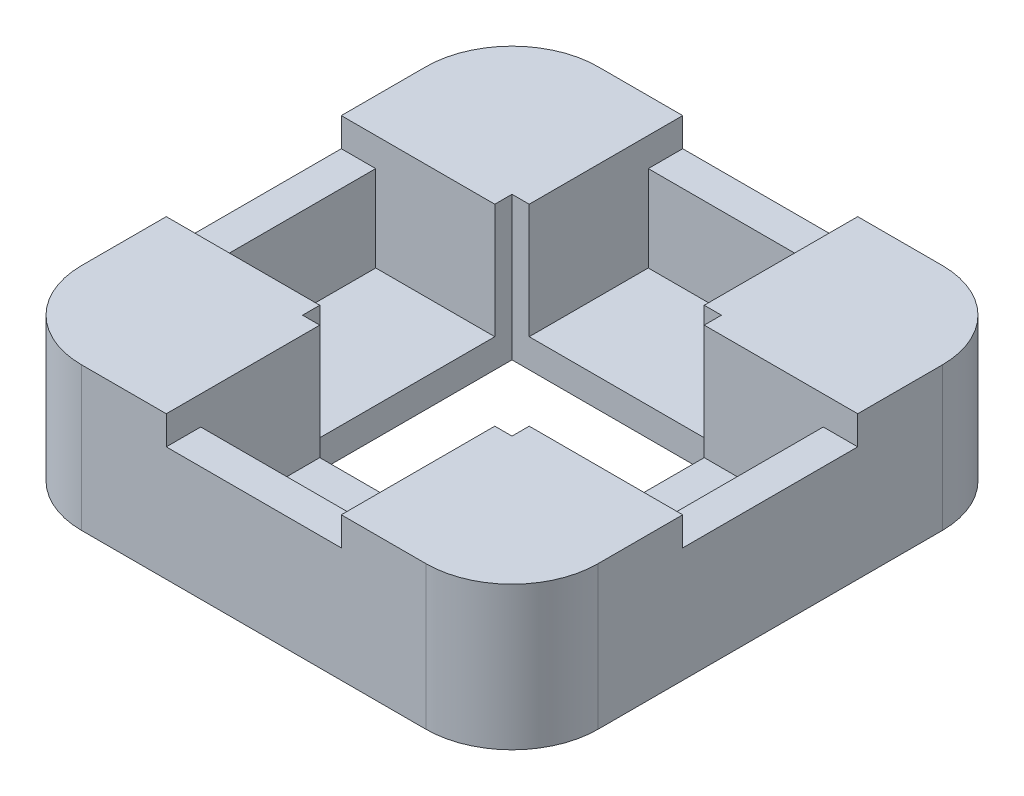
ISO-10303-21;
HEADER;
FILE_DESCRIPTION(('STEP AP214'),'2;1');
FILE_NAME('part.step','',(''),(''),'','','');
FILE_SCHEMA(('AUTOMOTIVE_DESIGN { 1 0 10303 214 1 1 1 1 }'));
ENDSEC;
DATA;
#1=APPLICATION_CONTEXT('core data for automotive mechanical design processes');
#2=APPLICATION_PROTOCOL_DEFINITION('international standard','automotive_design',2000,#1);
#3=PRODUCT_CONTEXT('',#1,'mechanical');
#4=PRODUCT('Part','Part','',(#3));
#5=PRODUCT_RELATED_PRODUCT_CATEGORY('part','',(#4));
#6=PRODUCT_DEFINITION_FORMATION('','',#4);
#7=PRODUCT_DEFINITION_CONTEXT('part definition',#1,'design');
#8=PRODUCT_DEFINITION('design','',#6,#7);
#9=PRODUCT_DEFINITION_SHAPE('','',#8);
#10=(LENGTH_UNIT() NAMED_UNIT(*) SI_UNIT(.MILLI.,.METRE.));
#11=(NAMED_UNIT(*) PLANE_ANGLE_UNIT() SI_UNIT($,.RADIAN.));
#12=(NAMED_UNIT(*) SI_UNIT($,.STERADIAN.) SOLID_ANGLE_UNIT());
#13=UNCERTAINTY_MEASURE_WITH_UNIT(LENGTH_MEASURE(1.E-05),#10,'distance_accuracy_value','');
#14=(GEOMETRIC_REPRESENTATION_CONTEXT(3) GLOBAL_UNCERTAINTY_ASSIGNED_CONTEXT((#13)) GLOBAL_UNIT_ASSIGNED_CONTEXT((#10,
#11,#12)) REPRESENTATION_CONTEXT('',''));
#15=CARTESIAN_POINT('',(0.,0.,0.));
#16=DIRECTION('',(0.,0.,1.));
#17=DIRECTION('',(1.,0.,0.));
#18=AXIS2_PLACEMENT_3D('',#15,#16,#17);
#19=CARTESIAN_POINT('',(6.,4.,6.));
#20=DIRECTION('',(0.,1.,0.));
#21=DIRECTION('',(0.,0.,1.));
#22=AXIS2_PLACEMENT_3D('',#19,#20,#21);
#23=PLANE('',#22);
#24=DIRECTION('',(0.,0.,1.));
#25=VECTOR('',#24,1.);
#26=CARTESIAN_POINT('',(-7.79999999999999,4.,3.05));
#27=LINE('',#26,#25);
#28=CARTESIAN_POINT('',(-7.79999999999999,4.,-3.05));
#29=VERTEX_POINT('',#28);
#30=CARTESIAN_POINT('',(-7.79999999999999,4.,3.05));
#31=VERTEX_POINT('',#30);
#32=EDGE_CURVE('E411',#29,#31,#27,.T.);
#33=ORIENTED_EDGE('',*,*,#32,.F.);
#34=DIRECTION('',(1.,0.,0.));
#35=VECTOR('',#34,1.);
#36=CARTESIAN_POINT('',(-8.99999999999999,4.,-3.05));
#37=LINE('',#36,#35);
#38=CARTESIAN_POINT('',(-8.99999999999999,4.,-3.05));
#39=VERTEX_POINT('',#38);
#40=EDGE_CURVE('E299',#39,#29,#37,.T.);
#41=ORIENTED_EDGE('',*,*,#40,.F.);
#42=DIRECTION('',(0.,0.,1.));
#43=VECTOR('',#42,1.);
#44=CARTESIAN_POINT('',(-9.,4.,-6.));
#45=LINE('',#44,#43);
#46=CARTESIAN_POINT('',(-8.99999999999999,4.,3.05));
#47=VERTEX_POINT('',#46);
#48=EDGE_CURVE('E485',#39,#47,#45,.T.);
#49=ORIENTED_EDGE('',*,*,#48,.T.);
#50=DIRECTION('',(-1.,0.,0.));
#51=VECTOR('',#50,1.);
#52=CARTESIAN_POINT('',(-8.99999999999999,4.,3.05));
#53=LINE('',#52,#51);
#54=EDGE_CURVE('E11',#31,#47,#53,.T.);
#55=ORIENTED_EDGE('',*,*,#54,.F.);
#56=EDGE_LOOP('',(#33,#41,#49,#55));
#57=FACE_BOUND('',#56,.T.);
#58=ADVANCED_FACE('F34',(#57),#23,.T.);
#59=DIRECTION('',(-1.,0.,0.));
#60=VECTOR('',#59,1.);
#61=CARTESIAN_POINT('',(6.,4.,-9.));
#62=LINE('',#61,#60);
#63=CARTESIAN_POINT('',(3.05,4.,-9.));
#64=VERTEX_POINT('',#63);
#65=CARTESIAN_POINT('',(-3.05,4.,-9.));
#66=VERTEX_POINT('',#65);
#67=EDGE_CURVE('E482',#64,#66,#62,.T.);
#68=ORIENTED_EDGE('',*,*,#67,.T.);
#69=DIRECTION('',(0.,0.,-1.));
#70=VECTOR('',#69,1.);
#71=CARTESIAN_POINT('',(-3.05,4.,-3.65));
#72=LINE('',#71,#70);
#73=CARTESIAN_POINT('',(-3.05,4.,-7.8));
#74=VERTEX_POINT('',#73);
#75=EDGE_CURVE('E297',#74,#66,#72,.T.);
#76=ORIENTED_EDGE('',*,*,#75,.F.);
#77=DIRECTION('',(-1.,0.,0.));
#78=VECTOR('',#77,1.);
#79=CARTESIAN_POINT('',(-3.05,4.,-7.8));
#80=LINE('',#79,#78);
#81=CARTESIAN_POINT('',(3.05,4.,-7.8));
#82=VERTEX_POINT('',#81);
#83=EDGE_CURVE('E408',#82,#74,#80,.T.);
#84=ORIENTED_EDGE('',*,*,#83,.F.);
#85=DIRECTION('',(0.,0.,1.));
#86=VECTOR('',#85,1.);
#87=CARTESIAN_POINT('',(3.05,4.,-3.65));
#88=LINE('',#87,#86);
#89=EDGE_CURVE('E317',#64,#82,#88,.T.);
#90=ORIENTED_EDGE('',*,*,#89,.F.);
#91=EDGE_LOOP('',(#68,#76,#84,#90));
#92=FACE_BOUND('',#91,.T.);
#93=ADVANCED_FACE('F666',(#92),#23,.T.);
#94=DIRECTION('',(0.,0.,-1.));
#95=VECTOR('',#94,1.);
#96=CARTESIAN_POINT('',(9.,4.,6.));
#97=LINE('',#96,#95);
#98=CARTESIAN_POINT('',(8.99999999999999,4.,3.05));
#99=VERTEX_POINT('',#98);
#100=CARTESIAN_POINT('',(8.99999999999999,4.,-3.05));
#101=VERTEX_POINT('',#100);
#102=EDGE_CURVE('E479',#99,#101,#97,.T.);
#103=ORIENTED_EDGE('',*,*,#102,.T.);
#104=DIRECTION('',(1.,0.,0.));
#105=VECTOR('',#104,1.);
#106=CARTESIAN_POINT('',(8.99999999999999,4.,-3.05));
#107=LINE('',#106,#105);
#108=CARTESIAN_POINT('',(7.8,4.,-3.05));
#109=VERTEX_POINT('',#108);
#110=EDGE_CURVE('E322',#109,#101,#107,.T.);
#111=ORIENTED_EDGE('',*,*,#110,.F.);
#112=DIRECTION('',(0.,0.,-1.));
#113=VECTOR('',#112,1.);
#114=CARTESIAN_POINT('',(7.8,4.,3.05));
#115=LINE('',#114,#113);
#116=CARTESIAN_POINT('',(7.8,4.,3.05));
#117=VERTEX_POINT('',#116);
#118=EDGE_CURVE('E404',#117,#109,#115,.T.);
#119=ORIENTED_EDGE('',*,*,#118,.F.);
#120=DIRECTION('',(-1.,0.,0.));
#121=VECTOR('',#120,1.);
#122=CARTESIAN_POINT('',(8.99999999999999,4.,3.05));
#123=LINE('',#122,#121);
#124=EDGE_CURVE('E345',#99,#117,#123,.T.);
#125=ORIENTED_EDGE('',*,*,#124,.F.);
#126=EDGE_LOOP('',(#103,#111,#119,#125));
#127=FACE_BOUND('',#126,.T.);
#128=ADVANCED_FACE('F582',(#127),#23,.T.);
#129=DIRECTION('',(1.,0.,0.));
#130=VECTOR('',#129,1.);
#131=CARTESIAN_POINT('',(-5.99999999999999,4.,9.));
#132=LINE('',#131,#130);
#133=CARTESIAN_POINT('',(-3.05,4.,9.));
#134=VERTEX_POINT('',#133);
#135=CARTESIAN_POINT('',(3.05,4.,9.));
#136=VERTEX_POINT('',#135);
#137=EDGE_CURVE('E487',#134,#136,#132,.T.);
#138=ORIENTED_EDGE('',*,*,#137,.T.);
#139=DIRECTION('',(0.,0.,1.));
#140=VECTOR('',#139,1.);
#141=CARTESIAN_POINT('',(3.05,4.,3.65));
#142=LINE('',#141,#140);
#143=CARTESIAN_POINT('',(3.05,4.,7.8));
#144=VERTEX_POINT('',#143);
#145=EDGE_CURVE('E350',#144,#136,#142,.T.);
#146=ORIENTED_EDGE('',*,*,#145,.F.);
#147=DIRECTION('',(1.,0.,0.));
#148=VECTOR('',#147,1.);
#149=CARTESIAN_POINT('',(-3.05,4.,7.8));
#150=LINE('',#149,#148);
#151=CARTESIAN_POINT('',(-3.05,4.,7.8));
#152=VERTEX_POINT('',#151);
#153=EDGE_CURVE('E401',#152,#144,#150,.T.);
#154=ORIENTED_EDGE('',*,*,#153,.F.);
#155=DIRECTION('',(0.,0.,-1.));
#156=VECTOR('',#155,1.);
#157=CARTESIAN_POINT('',(-3.05,4.,3.65));
#158=LINE('',#157,#156);
#159=EDGE_CURVE('E373',#134,#152,#158,.T.);
#160=ORIENTED_EDGE('',*,*,#159,.F.);
#161=EDGE_LOOP('',(#138,#146,#154,#160));
#162=FACE_BOUND('',#161,.T.);
#163=ADVANCED_FACE('F664',(#162),#23,.T.);
#164=CARTESIAN_POINT('',(6.,1.,6.));
#165=DIRECTION('',(0.,1.,0.));
#166=DIRECTION('',(0.,0.,1.));
#167=AXIS2_PLACEMENT_3D('',#164,#165,#166);
#168=PLANE('',#167);
#169=DIRECTION('',(1.,0.,0.));
#170=VECTOR('',#169,1.);
#171=CARTESIAN_POINT('',(-3.65,1.,3.65));
#172=LINE('',#171,#170);
#173=CARTESIAN_POINT('',(-3.05,1.,3.65));
#174=VERTEX_POINT('',#173);
#175=CARTESIAN_POINT('',(3.05,1.,3.65));
#176=VERTEX_POINT('',#175);
#177=EDGE_CURVE('E500',#174,#176,#172,.T.);
#178=ORIENTED_EDGE('',*,*,#177,.F.);
#179=DIRECTION('',(0.,0.,1.));
#180=VECTOR('',#179,1.);
#181=CARTESIAN_POINT('',(-3.05,1.,3.65));
#182=LINE('',#181,#180);
#183=CARTESIAN_POINT('',(-3.05,1.,7.8));
#184=VERTEX_POINT('',#183);
#185=EDGE_CURVE('E400',#174,#184,#182,.T.);
#186=ORIENTED_EDGE('',*,*,#185,.T.);
#187=DIRECTION('',(1.,0.,0.));
#188=VECTOR('',#187,1.);
#189=CARTESIAN_POINT('',(-3.05,1.,7.8));
#190=LINE('',#189,#188);
#191=CARTESIAN_POINT('',(3.05,1.,7.8));
#192=VERTEX_POINT('',#191);
#193=EDGE_CURVE('E416',#184,#192,#190,.T.);
#194=ORIENTED_EDGE('',*,*,#193,.T.);
#195=DIRECTION('',(0.,0.,-1.));
#196=VECTOR('',#195,1.);
#197=CARTESIAN_POINT('',(3.05,1.,3.65));
#198=LINE('',#197,#196);
#199=EDGE_CURVE('E419',#192,#176,#198,.T.);
#200=ORIENTED_EDGE('',*,*,#199,.T.);
#201=EDGE_LOOP('',(#178,#186,#194,#200));
#202=FACE_BOUND('',#201,.T.);
#203=ADVANCED_FACE('F621',(#202),#168,.T.);
#204=DIRECTION('',(0.,0.,-1.));
#205=VECTOR('',#204,1.);
#206=CARTESIAN_POINT('',(3.65,1.,3.65));
#207=LINE('',#206,#205);
#208=CARTESIAN_POINT('',(3.65,1.,3.05));
#209=VERTEX_POINT('',#208);
#210=CARTESIAN_POINT('',(3.65,1.,-3.05));
#211=VERTEX_POINT('',#210);
#212=EDGE_CURVE('E490',#209,#211,#207,.T.);
#213=ORIENTED_EDGE('',*,*,#212,.F.);
#214=DIRECTION('',(1.,0.,0.));
#215=VECTOR('',#214,1.);
#216=CARTESIAN_POINT('',(3.65,1.,3.05));
#217=LINE('',#216,#215);
#218=CARTESIAN_POINT('',(7.8,1.,3.05));
#219=VERTEX_POINT('',#218);
#220=EDGE_CURVE('E422',#209,#219,#217,.T.);
#221=ORIENTED_EDGE('',*,*,#220,.T.);
#222=DIRECTION('',(0.,0.,-1.));
#223=VECTOR('',#222,1.);
#224=CARTESIAN_POINT('',(7.8,1.,3.05));
#225=LINE('',#224,#223);
#226=CARTESIAN_POINT('',(7.8,1.,-3.05));
#227=VERTEX_POINT('',#226);
#228=EDGE_CURVE('E425',#219,#227,#225,.T.);
#229=ORIENTED_EDGE('',*,*,#228,.T.);
#230=DIRECTION('',(-1.,0.,0.));
#231=VECTOR('',#230,1.);
#232=CARTESIAN_POINT('',(3.65,1.,-3.05));
#233=LINE('',#232,#231);
#234=EDGE_CURVE('E428',#227,#211,#233,.T.);
#235=ORIENTED_EDGE('',*,*,#234,.T.);
#236=EDGE_LOOP('',(#213,#221,#229,#235));
#237=FACE_BOUND('',#236,.T.);
#238=ADVANCED_FACE('F596',(#237),#168,.T.);
#239=DIRECTION('',(-1.,0.,0.));
#240=VECTOR('',#239,1.);
#241=CARTESIAN_POINT('',(-3.65,1.,-3.65));
#242=LINE('',#241,#240);
#243=CARTESIAN_POINT('',(3.05,1.,-3.65));
#244=VERTEX_POINT('',#243);
#245=CARTESIAN_POINT('',(-3.05,1.,-3.65));
#246=VERTEX_POINT('',#245);
#247=EDGE_CURVE('E493',#244,#246,#242,.T.);
#248=ORIENTED_EDGE('',*,*,#247,.F.);
#249=DIRECTION('',(0.,0.,-1.));
#250=VECTOR('',#249,1.);
#251=CARTESIAN_POINT('',(3.05,1.,-3.65));
#252=LINE('',#251,#250);
#253=CARTESIAN_POINT('',(3.05,1.,-7.8));
#254=VERTEX_POINT('',#253);
#255=EDGE_CURVE('E431',#244,#254,#252,.T.);
#256=ORIENTED_EDGE('',*,*,#255,.T.);
#257=DIRECTION('',(-1.,0.,0.));
#258=VECTOR('',#257,1.);
#259=CARTESIAN_POINT('',(-3.05,1.,-7.8));
#260=LINE('',#259,#258);
#261=CARTESIAN_POINT('',(-3.05,1.,-7.8));
#262=VERTEX_POINT('',#261);
#263=EDGE_CURVE('E434',#254,#262,#260,.T.);
#264=ORIENTED_EDGE('',*,*,#263,.T.);
#265=DIRECTION('',(0.,0.,1.));
#266=VECTOR('',#265,1.);
#267=CARTESIAN_POINT('',(-3.05,1.,-3.65));
#268=LINE('',#267,#266);
#269=EDGE_CURVE('E437',#262,#246,#268,.T.);
#270=ORIENTED_EDGE('',*,*,#269,.T.);
#271=EDGE_LOOP('',(#248,#256,#264,#270));
#272=FACE_BOUND('',#271,.T.);
#273=ADVANCED_FACE('F654',(#272),#168,.T.);
#274=DIRECTION('',(0.,0.,1.));
#275=VECTOR('',#274,1.);
#276=CARTESIAN_POINT('',(-3.65,1.,3.65));
#277=LINE('',#276,#275);
#278=CARTESIAN_POINT('',(-3.65,1.,-3.05));
#279=VERTEX_POINT('',#278);
#280=CARTESIAN_POINT('',(-3.65,1.,3.05));
#281=VERTEX_POINT('',#280);
#282=EDGE_CURVE('E497',#279,#281,#277,.T.);
#283=ORIENTED_EDGE('',*,*,#282,.F.);
#284=DIRECTION('',(-1.,0.,0.));
#285=VECTOR('',#284,1.);
#286=CARTESIAN_POINT('',(-3.65,1.,-3.05));
#287=LINE('',#286,#285);
#288=CARTESIAN_POINT('',(-7.79999999999999,1.,-3.05));
#289=VERTEX_POINT('',#288);
#290=EDGE_CURVE('E440',#279,#289,#287,.T.);
#291=ORIENTED_EDGE('',*,*,#290,.T.);
#292=DIRECTION('',(0.,0.,1.));
#293=VECTOR('',#292,1.);
#294=CARTESIAN_POINT('',(-7.79999999999999,1.,3.05));
#295=LINE('',#294,#293);
#296=CARTESIAN_POINT('',(-7.79999999999999,1.,3.05));
#297=VERTEX_POINT('',#296);
#298=EDGE_CURVE('E443',#289,#297,#295,.T.);
#299=ORIENTED_EDGE('',*,*,#298,.T.);
#300=DIRECTION('',(1.,0.,0.));
#301=VECTOR('',#300,1.);
#302=CARTESIAN_POINT('',(-3.65,1.,3.05));
#303=LINE('',#302,#301);
#304=EDGE_CURVE('E405',#297,#281,#303,.T.);
#305=ORIENTED_EDGE('',*,*,#304,.T.);
#306=EDGE_LOOP('',(#283,#291,#299,#305));
#307=FACE_BOUND('',#306,.T.);
#308=ADVANCED_FACE('F652',(#307),#168,.T.);
#309=CARTESIAN_POINT('',(6.,0.,6.));
#310=DIRECTION('',(0.,1.,0.));
#311=DIRECTION('',(0.,0.,1.));
#312=AXIS2_PLACEMENT_3D('',#309,#310,#311);
#313=PLANE('',#312);
#314=CARTESIAN_POINT('',(6.,0.,6.));
#315=DIRECTION('',(0.,1.,0.));
#316=DIRECTION('',(0.,0.,1.));
#317=AXIS2_PLACEMENT_3D('',#314,#315,#316);
#318=CIRCLE('',#317,3.);
#319=CARTESIAN_POINT('',(6.,0.,9.));
#320=VERTEX_POINT('',#319);
#321=CARTESIAN_POINT('',(9.,0.,6.));
#322=VERTEX_POINT('',#321);
#323=EDGE_CURVE('E520',#320,#322,#318,.T.);
#324=ORIENTED_EDGE('',*,*,#323,.F.);
#325=DIRECTION('',(1.,0.,0.));
#326=VECTOR('',#325,1.);
#327=CARTESIAN_POINT('',(-5.99999999999999,0.,9.));
#328=LINE('',#327,#326);
#329=CARTESIAN_POINT('',(-5.99999999999999,0.,9.));
#330=VERTEX_POINT('',#329);
#331=EDGE_CURVE('E534',#330,#320,#328,.T.);
#332=ORIENTED_EDGE('',*,*,#331,.F.);
#333=CARTESIAN_POINT('',(-5.99999999999999,0.,6.));
#334=DIRECTION('',(0.,1.,0.));
#335=DIRECTION('',(0.,0.,-1.));
#336=AXIS2_PLACEMENT_3D('',#333,#334,#335);
#337=CIRCLE('',#336,3.);
#338=CARTESIAN_POINT('',(-8.99999999999999,0.,6.));
#339=VERTEX_POINT('',#338);
#340=EDGE_CURVE('E532',#339,#330,#337,.T.);
#341=ORIENTED_EDGE('',*,*,#340,.F.);
#342=DIRECTION('',(0.,0.,1.));
#343=VECTOR('',#342,1.);
#344=CARTESIAN_POINT('',(-9.,0.,6.));
#345=LINE('',#344,#343);
#346=CARTESIAN_POINT('',(-9.,0.,-6.));
#347=VERTEX_POINT('',#346);
#348=EDGE_CURVE('E530',#347,#339,#345,.T.);
#349=ORIENTED_EDGE('',*,*,#348,.F.);
#350=CARTESIAN_POINT('',(-5.99999999999999,0.,-6.));
#351=DIRECTION('',(0.,1.,0.));
#352=DIRECTION('',(0.,0.,1.));
#353=AXIS2_PLACEMENT_3D('',#350,#351,#352);
#354=CIRCLE('',#353,3.);
#355=CARTESIAN_POINT('',(-5.99999999999999,0.,-9.));
#356=VERTEX_POINT('',#355);
#357=EDGE_CURVE('E277',#356,#347,#354,.T.);
#358=ORIENTED_EDGE('',*,*,#357,.F.);
#359=DIRECTION('',(-1.,0.,0.));
#360=VECTOR('',#359,1.);
#361=CARTESIAN_POINT('',(-5.99999999999999,0.,-9.));
#362=LINE('',#361,#360);
#363=CARTESIAN_POINT('',(6.,0.,-9.));
#364=VERTEX_POINT('',#363);
#365=EDGE_CURVE('E527',#364,#356,#362,.T.);
#366=ORIENTED_EDGE('',*,*,#365,.F.);
#367=CARTESIAN_POINT('',(6.,0.,-6.));
#368=DIRECTION('',(0.,1.,0.));
#369=DIRECTION('',(0.,0.,-1.));
#370=AXIS2_PLACEMENT_3D('',#367,#368,#369);
#371=CIRCLE('',#370,3.);
#372=CARTESIAN_POINT('',(9.,0.,-6.));
#373=VERTEX_POINT('',#372);
#374=EDGE_CURVE('E525',#373,#364,#371,.T.);
#375=ORIENTED_EDGE('',*,*,#374,.F.);
#376=DIRECTION('',(0.,0.,-1.));
#377=VECTOR('',#376,1.);
#378=CARTESIAN_POINT('',(9.,0.,6.));
#379=LINE('',#378,#377);
#380=EDGE_CURVE('E523',#322,#373,#379,.T.);
#381=ORIENTED_EDGE('',*,*,#380,.F.);
#382=EDGE_LOOP('',(#324,#332,#341,#349,#358,#366,#375,#381));
#383=FACE_BOUND('',#382,.T.);
#384=DIRECTION('',(0.,0.,-1.));
#385=VECTOR('',#384,1.);
#386=CARTESIAN_POINT('',(3.65,0.,3.65));
#387=LINE('',#386,#385);
#388=CARTESIAN_POINT('',(3.65,0.,3.65));
#389=VERTEX_POINT('',#388);
#390=CARTESIAN_POINT('',(3.65,0.,-3.65));
#391=VERTEX_POINT('',#390);
#392=EDGE_CURVE('E58',#389,#391,#387,.T.);
#393=ORIENTED_EDGE('',*,*,#392,.T.);
#394=DIRECTION('',(-1.,0.,0.));
#395=VECTOR('',#394,1.);
#396=CARTESIAN_POINT('',(-3.65,0.,-3.65));
#397=LINE('',#396,#395);
#398=CARTESIAN_POINT('',(-3.65,0.,-3.65));
#399=VERTEX_POINT('',#398);
#400=EDGE_CURVE('E505',#391,#399,#397,.T.);
#401=ORIENTED_EDGE('',*,*,#400,.T.);
#402=DIRECTION('',(0.,0.,1.));
#403=VECTOR('',#402,1.);
#404=CARTESIAN_POINT('',(-3.65,0.,3.65));
#405=LINE('',#404,#403);
#406=CARTESIAN_POINT('',(-3.65,0.,3.65));
#407=VERTEX_POINT('',#406);
#408=EDGE_CURVE('E508',#399,#407,#405,.T.);
#409=ORIENTED_EDGE('',*,*,#408,.T.);
#410=DIRECTION('',(1.,0.,0.));
#411=VECTOR('',#410,1.);
#412=CARTESIAN_POINT('',(-3.65,0.,3.65));
#413=LINE('',#412,#411);
#414=EDGE_CURVE('E494',#407,#389,#413,.T.);
#415=ORIENTED_EDGE('',*,*,#414,.T.);
#416=EDGE_LOOP('',(#393,#401,#409,#415));
#417=FACE_BOUND('',#416,.T.);
#418=ADVANCED_FACE('F562',(#383,#417),#313,.F.);
#419=CARTESIAN_POINT('',(6.,1.,6.));
#420=DIRECTION('',(0.,-1.,0.));
#421=DIRECTION('',(0.,0.,-1.));
#422=AXIS2_PLACEMENT_3D('',#419,#420,#421);
#423=CYLINDRICAL_SURFACE('',#422,3.);
#424=ORIENTED_EDGE('',*,*,#323,.T.);
#425=DIRECTION('',(0.,-1.,0.));
#426=VECTOR('',#425,1.);
#427=CARTESIAN_POINT('',(9.,1.,6.));
#428=LINE('',#427,#426);
#429=CARTESIAN_POINT('',(8.99999999999999,5.,6.));
#430=VERTEX_POINT('',#429);
#431=EDGE_CURVE('E38',#430,#322,#428,.T.);
#432=ORIENTED_EDGE('',*,*,#431,.F.);
#433=CARTESIAN_POINT('',(5.99999999999999,5.,5.99999999999999));
#434=DIRECTION('',(0.,1.,0.));
#435=DIRECTION('',(0.,0.,-1.));
#436=AXIS2_PLACEMENT_3D('',#433,#434,#435);
#437=CIRCLE('',#436,3.00000000000001);
#438=CARTESIAN_POINT('',(5.99999999999999,5.,9.));
#439=VERTEX_POINT('',#438);
#440=EDGE_CURVE('E346',#439,#430,#437,.T.);
#441=ORIENTED_EDGE('',*,*,#440,.F.);
#442=DIRECTION('',(0.,-1.,0.));
#443=VECTOR('',#442,1.);
#444=CARTESIAN_POINT('',(6.,1.,9.));
#445=LINE('',#444,#443);
#446=EDGE_CURVE('E536',#439,#320,#445,.T.);
#447=ORIENTED_EDGE('',*,*,#446,.T.);
#448=EDGE_LOOP('',(#424,#432,#441,#447));
#449=FACE_BOUND('',#448,.T.);
#450=ADVANCED_FACE('F36',(#449),#423,.T.);
#451=CARTESIAN_POINT('',(9.,1.,6.));
#452=DIRECTION('',(-1.,0.,0.));
#453=DIRECTION('',(0.,0.,1.));
#454=AXIS2_PLACEMENT_3D('',#451,#452,#453);
#455=PLANE('',#454);
#456=ORIENTED_EDGE('',*,*,#380,.T.);
#457=DIRECTION('',(0.,-1.,0.));
#458=VECTOR('',#457,1.);
#459=CARTESIAN_POINT('',(9.,1.,-6.));
#460=LINE('',#459,#458);
#461=CARTESIAN_POINT('',(8.99999999999999,5.,-6.));
#462=VERTEX_POINT('',#461);
#463=EDGE_CURVE('E547',#462,#373,#460,.T.);
#464=ORIENTED_EDGE('',*,*,#463,.F.);
#465=DIRECTION('',(0.,0.,-1.));
#466=VECTOR('',#465,1.);
#467=CARTESIAN_POINT('',(8.99999999999999,5.,-3.05));
#468=LINE('',#467,#466);
#469=CARTESIAN_POINT('',(8.99999999999999,5.,-3.05));
#470=VERTEX_POINT('',#469);
#471=EDGE_CURVE('E335',#470,#462,#468,.T.);
#472=ORIENTED_EDGE('',*,*,#471,.F.);
#473=DIRECTION('',(0.,-1.,0.));
#474=VECTOR('',#473,1.);
#475=CARTESIAN_POINT('',(8.99999999999999,5.,-3.05));
#476=LINE('',#475,#474);
#477=EDGE_CURVE('E338',#470,#101,#476,.T.);
#478=ORIENTED_EDGE('',*,*,#477,.T.);
#479=ORIENTED_EDGE('',*,*,#102,.F.);
#480=DIRECTION('',(0.,-1.,0.));
#481=VECTOR('',#480,1.);
#482=CARTESIAN_POINT('',(8.99999999999999,5.,3.05));
#483=LINE('',#482,#481);
#484=CARTESIAN_POINT('',(8.99999999999999,5.,3.05));
#485=VERTEX_POINT('',#484);
#486=EDGE_CURVE('E371',#485,#99,#483,.T.);
#487=ORIENTED_EDGE('',*,*,#486,.F.);
#488=DIRECTION('',(0.,0.,-1.));
#489=VECTOR('',#488,1.);
#490=CARTESIAN_POINT('',(8.99999999999999,5.,3.05));
#491=LINE('',#490,#489);
#492=EDGE_CURVE('E349',#430,#485,#491,.T.);
#493=ORIENTED_EDGE('',*,*,#492,.F.);
#494=ORIENTED_EDGE('',*,*,#431,.T.);
#495=EDGE_LOOP('',(#456,#464,#472,#478,#479,#487,#493,#494));
#496=FACE_BOUND('',#495,.T.);
#497=ADVANCED_FACE('F555',(#496),#455,.F.);
#498=CARTESIAN_POINT('',(6.,1.,-6.));
#499=DIRECTION('',(0.,-1.,0.));
#500=DIRECTION('',(0.,0.,-1.));
#501=AXIS2_PLACEMENT_3D('',#498,#499,#500);
#502=CYLINDRICAL_SURFACE('',#501,3.);
#503=ORIENTED_EDGE('',*,*,#374,.T.);
#504=DIRECTION('',(0.,-1.,0.));
#505=VECTOR('',#504,1.);
#506=CARTESIAN_POINT('',(6.,1.,-9.));
#507=LINE('',#506,#505);
#508=CARTESIAN_POINT('',(5.99999999999999,5.,-9.));
#509=VERTEX_POINT('',#508);
#510=EDGE_CURVE('E545',#509,#364,#507,.T.);
#511=ORIENTED_EDGE('',*,*,#510,.F.);
#512=CARTESIAN_POINT('',(5.99999999999999,5.,-5.99999999999999));
#513=DIRECTION('',(0.,1.,0.));
#514=DIRECTION('',(0.,0.,1.));
#515=AXIS2_PLACEMENT_3D('',#512,#513,#514);
#516=CIRCLE('',#515,3.00000000000001);
#517=EDGE_CURVE('E318',#462,#509,#516,.T.);
#518=ORIENTED_EDGE('',*,*,#517,.F.);
#519=ORIENTED_EDGE('',*,*,#463,.T.);
#520=EDGE_LOOP('',(#503,#511,#518,#519));
#521=FACE_BOUND('',#520,.T.);
#522=ADVANCED_FACE('F566',(#521),#502,.T.);
#523=CARTESIAN_POINT('',(-5.99999999999999,1.,-9.));
#524=DIRECTION('',(0.,0.,1.));
#525=DIRECTION('',(1.,0.,0.));
#526=AXIS2_PLACEMENT_3D('',#523,#524,#525);
#527=PLANE('',#526);
#528=ORIENTED_EDGE('',*,*,#365,.T.);
#529=DIRECTION('',(0.,-1.,0.));
#530=VECTOR('',#529,1.);
#531=CARTESIAN_POINT('',(-5.99999999999999,1.,-9.));
#532=LINE('',#531,#530);
#533=CARTESIAN_POINT('',(-5.99999999999999,5.,-9.));
#534=VERTEX_POINT('',#533);
#535=EDGE_CURVE('E280',#534,#356,#532,.T.);
#536=ORIENTED_EDGE('',*,*,#535,.F.);
#537=DIRECTION('',(-1.,0.,0.));
#538=VECTOR('',#537,1.);
#539=CARTESIAN_POINT('',(-5.99999999999999,5.,-9.));
#540=LINE('',#539,#538);
#541=CARTESIAN_POINT('',(-3.05,5.,-9.));
#542=VERTEX_POINT('',#541);
#543=EDGE_CURVE('E296',#542,#534,#540,.T.);
#544=ORIENTED_EDGE('',*,*,#543,.F.);
#545=DIRECTION('',(0.,-1.,0.));
#546=VECTOR('',#545,1.);
#547=CARTESIAN_POINT('',(-3.05,5.,-9.));
#548=LINE('',#547,#546);
#549=EDGE_CURVE('E312',#542,#66,#548,.T.);
#550=ORIENTED_EDGE('',*,*,#549,.T.);
#551=ORIENTED_EDGE('',*,*,#67,.F.);
#552=DIRECTION('',(0.,-1.,0.));
#553=VECTOR('',#552,1.);
#554=CARTESIAN_POINT('',(3.05,5.,-9.));
#555=LINE('',#554,#553);
#556=CARTESIAN_POINT('',(3.05,5.,-9.));
#557=VERTEX_POINT('',#556);
#558=EDGE_CURVE('E343',#557,#64,#555,.T.);
#559=ORIENTED_EDGE('',*,*,#558,.F.);
#560=DIRECTION('',(-1.,0.,0.));
#561=VECTOR('',#560,1.);
#562=CARTESIAN_POINT('',(5.99999999999999,5.,-9.));
#563=LINE('',#562,#561);
#564=EDGE_CURVE('E321',#509,#557,#563,.T.);
#565=ORIENTED_EDGE('',*,*,#564,.F.);
#566=ORIENTED_EDGE('',*,*,#510,.T.);
#567=EDGE_LOOP('',(#528,#536,#544,#550,#551,#559,#565,#566));
#568=FACE_BOUND('',#567,.T.);
#569=ADVANCED_FACE('F569',(#568),#527,.F.);
#570=CARTESIAN_POINT('',(-5.99999999999999,1.,-6.));
#571=DIRECTION('',(0.,-1.,0.));
#572=DIRECTION('',(0.,0.,-1.));
#573=AXIS2_PLACEMENT_3D('',#570,#571,#572);
#574=CYLINDRICAL_SURFACE('',#573,3.);
#575=ORIENTED_EDGE('',*,*,#357,.T.);
#576=DIRECTION('',(0.,-1.,0.));
#577=VECTOR('',#576,1.);
#578=CARTESIAN_POINT('',(-9.,1.,-6.));
#579=LINE('',#578,#577);
#580=CARTESIAN_POINT('',(-8.99999999999999,5.,-6.));
#581=VERTEX_POINT('',#580);
#582=EDGE_CURVE('E270',#581,#347,#579,.T.);
#583=ORIENTED_EDGE('',*,*,#582,.F.);
#584=CARTESIAN_POINT('',(-5.99999999999999,5.,-5.99999999999999));
#585=DIRECTION('',(0.,1.,0.));
#586=DIRECTION('',(0.,0.,-1.));
#587=AXIS2_PLACEMENT_3D('',#584,#585,#586);
#588=CIRCLE('',#587,3.00000000000001);
#589=EDGE_CURVE('E275',#534,#581,#588,.T.);
#590=ORIENTED_EDGE('',*,*,#589,.F.);
#591=ORIENTED_EDGE('',*,*,#535,.T.);
#592=EDGE_LOOP('',(#575,#583,#590,#591));
#593=FACE_BOUND('',#592,.T.);
#594=ADVANCED_FACE('F272',(#593),#574,.T.);
#595=CARTESIAN_POINT('',(-9.,1.,6.));
#596=DIRECTION('',(1.,0.,0.));
#597=DIRECTION('',(0.,0.,-1.));
#598=AXIS2_PLACEMENT_3D('',#595,#596,#597);
#599=PLANE('',#598);
#600=ORIENTED_EDGE('',*,*,#348,.T.);
#601=DIRECTION('',(0.,-1.,0.));
#602=VECTOR('',#601,1.);
#603=CARTESIAN_POINT('',(-8.99999999999999,1.,6.));
#604=LINE('',#603,#602);
#605=CARTESIAN_POINT('',(-8.99999999999999,5.,6.));
#606=VERTEX_POINT('',#605);
#607=EDGE_CURVE('E281',#606,#339,#604,.T.);
#608=ORIENTED_EDGE('',*,*,#607,.F.);
#609=DIRECTION('',(0.,0.,1.));
#610=VECTOR('',#609,1.);
#611=CARTESIAN_POINT('',(-8.99999999999999,5.,3.05));
#612=LINE('',#611,#610);
#613=CARTESIAN_POINT('',(-8.99999999999999,5.,3.05));
#614=VERTEX_POINT('',#613);
#615=EDGE_CURVE('E377',#614,#606,#612,.T.);
#616=ORIENTED_EDGE('',*,*,#615,.F.);
#617=DIRECTION('',(0.,-1.,0.));
#618=VECTOR('',#617,1.);
#619=CARTESIAN_POINT('',(-8.99999999999999,5.,3.05));
#620=LINE('',#619,#618);
#621=EDGE_CURVE('E397',#614,#47,#620,.T.);
#622=ORIENTED_EDGE('',*,*,#621,.T.);
#623=ORIENTED_EDGE('',*,*,#48,.F.);
#624=DIRECTION('',(0.,-1.,0.));
#625=VECTOR('',#624,1.);
#626=CARTESIAN_POINT('',(-8.99999999999999,5.,-3.05));
#627=LINE('',#626,#625);
#628=CARTESIAN_POINT('',(-8.99999999999999,5.,-3.05));
#629=VERTEX_POINT('',#628);
#630=EDGE_CURVE('E287',#629,#39,#627,.T.);
#631=ORIENTED_EDGE('',*,*,#630,.F.);
#632=DIRECTION('',(0.,0.,1.));
#633=VECTOR('',#632,1.);
#634=CARTESIAN_POINT('',(-8.99999999999999,5.,-3.05));
#635=LINE('',#634,#633);
#636=EDGE_CURVE('E284',#581,#629,#635,.T.);
#637=ORIENTED_EDGE('',*,*,#636,.F.);
#638=ORIENTED_EDGE('',*,*,#582,.T.);
#639=EDGE_LOOP('',(#600,#608,#616,#622,#623,#631,#637,#638));
#640=FACE_BOUND('',#639,.T.);
#641=ADVANCED_FACE('F285',(#640),#599,.F.);
#642=CARTESIAN_POINT('',(-5.99999999999999,1.,6.));
#643=DIRECTION('',(0.,-1.,0.));
#644=DIRECTION('',(0.,0.,-1.));
#645=AXIS2_PLACEMENT_3D('',#642,#643,#644);
#646=CYLINDRICAL_SURFACE('',#645,3.);
#647=ORIENTED_EDGE('',*,*,#340,.T.);
#648=DIRECTION('',(0.,-1.,0.));
#649=VECTOR('',#648,1.);
#650=CARTESIAN_POINT('',(-5.99999999999999,1.,9.));
#651=LINE('',#650,#649);
#652=CARTESIAN_POINT('',(-5.99999999999999,5.,9.));
#653=VERTEX_POINT('',#652);
#654=EDGE_CURVE('E539',#653,#330,#651,.T.);
#655=ORIENTED_EDGE('',*,*,#654,.F.);
#656=CARTESIAN_POINT('',(-5.99999999999999,5.,5.99999999999999));
#657=DIRECTION('',(0.,1.,0.));
#658=DIRECTION('',(0.,0.,1.));
#659=AXIS2_PLACEMENT_3D('',#656,#657,#658);
#660=CIRCLE('',#659,3.00000000000001);
#661=EDGE_CURVE('E380',#606,#653,#660,.T.);
#662=ORIENTED_EDGE('',*,*,#661,.F.);
#663=ORIENTED_EDGE('',*,*,#607,.T.);
#664=EDGE_LOOP('',(#647,#655,#662,#663));
#665=FACE_BOUND('',#664,.T.);
#666=ADVANCED_FACE('F635',(#665),#646,.T.);
#667=CARTESIAN_POINT('',(-5.99999999999999,1.,9.));
#668=DIRECTION('',(0.,0.,-1.));
#669=DIRECTION('',(-1.,0.,0.));
#670=AXIS2_PLACEMENT_3D('',#667,#668,#669);
#671=PLANE('',#670);
#672=ORIENTED_EDGE('',*,*,#331,.T.);
#673=ORIENTED_EDGE('',*,*,#446,.F.);
#674=DIRECTION('',(1.,0.,0.));
#675=VECTOR('',#674,1.);
#676=CARTESIAN_POINT('',(5.99999999999999,5.,9.));
#677=LINE('',#676,#675);
#678=CARTESIAN_POINT('',(3.05,5.,9.));
#679=VERTEX_POINT('',#678);
#680=EDGE_CURVE('E363',#679,#439,#677,.T.);
#681=ORIENTED_EDGE('',*,*,#680,.F.);
#682=DIRECTION('',(0.,-1.,0.));
#683=VECTOR('',#682,1.);
#684=CARTESIAN_POINT('',(3.05,5.,9.));
#685=LINE('',#684,#683);
#686=EDGE_CURVE('E366',#679,#136,#685,.T.);
#687=ORIENTED_EDGE('',*,*,#686,.T.);
#688=ORIENTED_EDGE('',*,*,#137,.F.);
#689=DIRECTION('',(0.,-1.,0.));
#690=VECTOR('',#689,1.);
#691=CARTESIAN_POINT('',(-3.05,5.,9.));
#692=LINE('',#691,#690);
#693=CARTESIAN_POINT('',(-3.05,5.,9.));
#694=VERTEX_POINT('',#693);
#695=EDGE_CURVE('E393',#694,#134,#692,.T.);
#696=ORIENTED_EDGE('',*,*,#695,.F.);
#697=DIRECTION('',(1.,0.,0.));
#698=VECTOR('',#697,1.);
#699=CARTESIAN_POINT('',(-5.99999999999999,5.,9.));
#700=LINE('',#699,#698);
#701=EDGE_CURVE('E383',#653,#694,#700,.T.);
#702=ORIENTED_EDGE('',*,*,#701,.F.);
#703=ORIENTED_EDGE('',*,*,#654,.T.);
#704=EDGE_LOOP('',(#672,#673,#681,#687,#688,#696,#702,#703));
#705=FACE_BOUND('',#704,.T.);
#706=ADVANCED_FACE('F632',(#705),#671,.F.);
#707=CARTESIAN_POINT('',(3.65,1.,3.65));
#708=DIRECTION('',(-1.,0.,0.));
#709=DIRECTION('',(0.,0.,1.));
#710=AXIS2_PLACEMENT_3D('',#707,#708,#709);
#711=PLANE('',#710);
#712=ORIENTED_EDGE('',*,*,#392,.F.);
#713=DIRECTION('',(0.,-1.,0.));
#714=VECTOR('',#713,1.);
#715=CARTESIAN_POINT('',(3.65,1.,3.65));
#716=LINE('',#715,#714);
#717=CARTESIAN_POINT('',(3.65,5.,3.65));
#718=VERTEX_POINT('',#717);
#719=EDGE_CURVE('E503',#718,#389,#716,.T.);
#720=ORIENTED_EDGE('',*,*,#719,.F.);
#721=DIRECTION('',(0.,0.,1.));
#722=VECTOR('',#721,1.);
#723=CARTESIAN_POINT('',(3.65,5.,3.05));
#724=LINE('',#723,#722);
#725=CARTESIAN_POINT('',(3.65,5.,3.05));
#726=VERTEX_POINT('',#725);
#727=EDGE_CURVE('E355',#726,#718,#724,.T.);
#728=ORIENTED_EDGE('',*,*,#727,.F.);
#729=DIRECTION('',(0.,-1.,0.));
#730=VECTOR('',#729,1.);
#731=CARTESIAN_POINT('',(3.65,4.,3.05));
#732=LINE('',#731,#730);
#733=EDGE_CURVE('E468',#726,#209,#732,.T.);
#734=ORIENTED_EDGE('',*,*,#733,.T.);
#735=ORIENTED_EDGE('',*,*,#212,.T.);
#736=DIRECTION('',(0.,-1.,0.));
#737=VECTOR('',#736,1.);
#738=CARTESIAN_POINT('',(3.65,4.,-3.05));
#739=LINE('',#738,#737);
#740=CARTESIAN_POINT('',(3.65,5.,-3.05));
#741=VERTEX_POINT('',#740);
#742=EDGE_CURVE('E462',#741,#211,#739,.T.);
#743=ORIENTED_EDGE('',*,*,#742,.F.);
#744=DIRECTION('',(0.,0.,1.));
#745=VECTOR('',#744,1.);
#746=CARTESIAN_POINT('',(3.65,5.,-3.05));
#747=LINE('',#746,#745);
#748=CARTESIAN_POINT('',(3.65,5.,-3.65));
#749=VERTEX_POINT('',#748);
#750=EDGE_CURVE('E330',#749,#741,#747,.T.);
#751=ORIENTED_EDGE('',*,*,#750,.F.);
#752=DIRECTION('',(0.,-1.,0.));
#753=VECTOR('',#752,1.);
#754=CARTESIAN_POINT('',(3.65,1.,-3.65));
#755=LINE('',#754,#753);
#756=EDGE_CURVE('E518',#749,#391,#755,.T.);
#757=ORIENTED_EDGE('',*,*,#756,.T.);
#758=EDGE_LOOP('',(#712,#720,#728,#734,#735,#743,#751,#757));
#759=FACE_BOUND('',#758,.T.);
#760=ADVANCED_FACE('F601',(#759),#711,.T.);
#761=CARTESIAN_POINT('',(-3.65,1.,-3.65));
#762=DIRECTION('',(0.,0.,1.));
#763=DIRECTION('',(1.,0.,0.));
#764=AXIS2_PLACEMENT_3D('',#761,#762,#763);
#765=PLANE('',#764);
#766=ORIENTED_EDGE('',*,*,#400,.F.);
#767=ORIENTED_EDGE('',*,*,#756,.F.);
#768=DIRECTION('',(1.,0.,0.));
#769=VECTOR('',#768,1.);
#770=CARTESIAN_POINT('',(3.65,5.,-3.65));
#771=LINE('',#770,#769);
#772=CARTESIAN_POINT('',(3.05,5.,-3.65));
#773=VERTEX_POINT('',#772);
#774=EDGE_CURVE('E327',#773,#749,#771,.T.);
#775=ORIENTED_EDGE('',*,*,#774,.F.);
#776=DIRECTION('',(0.,-1.,0.));
#777=VECTOR('',#776,1.);
#778=CARTESIAN_POINT('',(3.05,4.,-3.65));
#779=LINE('',#778,#777);
#780=EDGE_CURVE('E460',#773,#244,#779,.T.);
#781=ORIENTED_EDGE('',*,*,#780,.T.);
#782=ORIENTED_EDGE('',*,*,#247,.T.);
#783=DIRECTION('',(0.,-1.,0.));
#784=VECTOR('',#783,1.);
#785=CARTESIAN_POINT('',(-3.05,4.,-3.65));
#786=LINE('',#785,#784);
#787=CARTESIAN_POINT('',(-3.05,5.,-3.65));
#788=VERTEX_POINT('',#787);
#789=EDGE_CURVE('E454',#788,#246,#786,.T.);
#790=ORIENTED_EDGE('',*,*,#789,.F.);
#791=DIRECTION('',(1.,0.,0.));
#792=VECTOR('',#791,1.);
#793=CARTESIAN_POINT('',(-3.65,5.,-3.65));
#794=LINE('',#793,#792);
#795=CARTESIAN_POINT('',(-3.65,5.,-3.65));
#796=VERTEX_POINT('',#795);
#797=EDGE_CURVE('E306',#796,#788,#794,.T.);
#798=ORIENTED_EDGE('',*,*,#797,.F.);
#799=DIRECTION('',(0.,-1.,0.));
#800=VECTOR('',#799,1.);
#801=CARTESIAN_POINT('',(-3.65,1.,-3.65));
#802=LINE('',#801,#800);
#803=EDGE_CURVE('E516',#796,#399,#802,.T.);
#804=ORIENTED_EDGE('',*,*,#803,.T.);
#805=EDGE_LOOP('',(#766,#767,#775,#781,#782,#790,#798,#804));
#806=FACE_BOUND('',#805,.T.);
#807=ADVANCED_FACE('F806',(#806),#765,.T.);
#808=CARTESIAN_POINT('',(-3.65,1.,3.65));
#809=DIRECTION('',(1.,0.,0.));
#810=DIRECTION('',(0.,0.,-1.));
#811=AXIS2_PLACEMENT_3D('',#808,#809,#810);
#812=PLANE('',#811);
#813=ORIENTED_EDGE('',*,*,#408,.F.);
#814=ORIENTED_EDGE('',*,*,#803,.F.);
#815=DIRECTION('',(0.,0.,-1.));
#816=VECTOR('',#815,1.);
#817=CARTESIAN_POINT('',(-3.65,5.,-3.05));
#818=LINE('',#817,#816);
#819=CARTESIAN_POINT('',(-3.65,5.,-3.05));
#820=VERTEX_POINT('',#819);
#821=EDGE_CURVE('E303',#820,#796,#818,.T.);
#822=ORIENTED_EDGE('',*,*,#821,.F.);
#823=DIRECTION('',(0.,-1.,0.));
#824=VECTOR('',#823,1.);
#825=CARTESIAN_POINT('',(-3.65,4.,-3.05));
#826=LINE('',#825,#824);
#827=EDGE_CURVE('E452',#820,#279,#826,.T.);
#828=ORIENTED_EDGE('',*,*,#827,.T.);
#829=ORIENTED_EDGE('',*,*,#282,.T.);
#830=DIRECTION('',(0.,-1.,0.));
#831=VECTOR('',#830,1.);
#832=CARTESIAN_POINT('',(-3.65,4.,3.05));
#833=LINE('',#832,#831);
#834=CARTESIAN_POINT('',(-3.65,5.,3.05));
#835=VERTEX_POINT('',#834);
#836=EDGE_CURVE('E50',#835,#281,#833,.T.);
#837=ORIENTED_EDGE('',*,*,#836,.F.);
#838=DIRECTION('',(0.,0.,-1.));
#839=VECTOR('',#838,1.);
#840=CARTESIAN_POINT('',(-3.65,5.,3.05));
#841=LINE('',#840,#839);
#842=CARTESIAN_POINT('',(-3.65,5.,3.65));
#843=VERTEX_POINT('',#842);
#844=EDGE_CURVE('E391',#843,#835,#841,.T.);
#845=ORIENTED_EDGE('',*,*,#844,.F.);
#846=DIRECTION('',(0.,-1.,0.));
#847=VECTOR('',#846,1.);
#848=CARTESIAN_POINT('',(-3.65,1.,3.65));
#849=LINE('',#848,#847);
#850=EDGE_CURVE('E514',#843,#407,#849,.T.);
#851=ORIENTED_EDGE('',*,*,#850,.T.);
#852=EDGE_LOOP('',(#813,#814,#822,#828,#829,#837,#845,#851));
#853=FACE_BOUND('',#852,.T.);
#854=ADVANCED_FACE('F607',(#853),#812,.T.);
#855=CARTESIAN_POINT('',(-3.65,1.,3.65));
#856=DIRECTION('',(0.,0.,-1.));
#857=DIRECTION('',(-1.,0.,0.));
#858=AXIS2_PLACEMENT_3D('',#855,#856,#857);
#859=PLANE('',#858);
#860=ORIENTED_EDGE('',*,*,#414,.F.);
#861=ORIENTED_EDGE('',*,*,#850,.F.);
#862=DIRECTION('',(-1.,0.,0.));
#863=VECTOR('',#862,1.);
#864=CARTESIAN_POINT('',(-3.65,5.,3.65));
#865=LINE('',#864,#863);
#866=CARTESIAN_POINT('',(-3.05,5.,3.65));
#867=VERTEX_POINT('',#866);
#868=EDGE_CURVE('E388',#867,#843,#865,.T.);
#869=ORIENTED_EDGE('',*,*,#868,.F.);
#870=DIRECTION('',(0.,-1.,0.));
#871=VECTOR('',#870,1.);
#872=CARTESIAN_POINT('',(-3.05,4.,3.65));
#873=LINE('',#872,#871);
#874=EDGE_CURVE('E476',#867,#174,#873,.T.);
#875=ORIENTED_EDGE('',*,*,#874,.T.);
#876=ORIENTED_EDGE('',*,*,#177,.T.);
#877=DIRECTION('',(0.,-1.,0.));
#878=VECTOR('',#877,1.);
#879=CARTESIAN_POINT('',(3.05,4.,3.65));
#880=LINE('',#879,#878);
#881=CARTESIAN_POINT('',(3.05,5.,3.65));
#882=VERTEX_POINT('',#881);
#883=EDGE_CURVE('E470',#882,#176,#880,.T.);
#884=ORIENTED_EDGE('',*,*,#883,.F.);
#885=DIRECTION('',(-1.,0.,0.));
#886=VECTOR('',#885,1.);
#887=CARTESIAN_POINT('',(3.65,5.,3.65));
#888=LINE('',#887,#886);
#889=EDGE_CURVE('E358',#718,#882,#888,.T.);
#890=ORIENTED_EDGE('',*,*,#889,.F.);
#891=ORIENTED_EDGE('',*,*,#719,.T.);
#892=EDGE_LOOP('',(#860,#861,#869,#875,#876,#884,#890,#891));
#893=FACE_BOUND('',#892,.T.);
#894=ADVANCED_FACE('F604',(#893),#859,.T.);
#895=CARTESIAN_POINT('',(-3.05,4.,3.65));
#896=DIRECTION('',(1.,0.,0.));
#897=DIRECTION('',(0.,0.,-1.));
#898=AXIS2_PLACEMENT_3D('',#895,#896,#897);
#899=PLANE('',#898);
#900=ORIENTED_EDGE('',*,*,#185,.F.);
#901=ORIENTED_EDGE('',*,*,#874,.F.);
#902=DIRECTION('',(0.,0.,-1.));
#903=VECTOR('',#902,1.);
#904=CARTESIAN_POINT('',(-3.05,5.,3.65));
#905=LINE('',#904,#903);
#906=EDGE_CURVE('E385',#694,#867,#905,.T.);
#907=ORIENTED_EDGE('',*,*,#906,.F.);
#908=ORIENTED_EDGE('',*,*,#695,.T.);
#909=ORIENTED_EDGE('',*,*,#159,.T.);
#910=DIRECTION('',(0.,-1.,0.));
#911=VECTOR('',#910,1.);
#912=CARTESIAN_POINT('',(-3.05,4.,7.8));
#913=LINE('',#912,#911);
#914=EDGE_CURVE('E474',#152,#184,#913,.T.);
#915=ORIENTED_EDGE('',*,*,#914,.T.);
#916=EDGE_LOOP('',(#900,#901,#907,#908,#909,#915));
#917=FACE_BOUND('',#916,.T.);
#918=ADVANCED_FACE('F617',(#917),#899,.T.);
#919=CARTESIAN_POINT('',(-3.05,4.,7.8));
#920=DIRECTION('',(0.,0.,-1.));
#921=DIRECTION('',(-1.,0.,0.));
#922=AXIS2_PLACEMENT_3D('',#919,#920,#921);
#923=PLANE('',#922);
#924=ORIENTED_EDGE('',*,*,#193,.F.);
#925=ORIENTED_EDGE('',*,*,#914,.F.);
#926=ORIENTED_EDGE('',*,*,#153,.T.);
#927=DIRECTION('',(0.,-1.,0.));
#928=VECTOR('',#927,1.);
#929=CARTESIAN_POINT('',(3.05,4.,7.8));
#930=LINE('',#929,#928);
#931=EDGE_CURVE('E472',#144,#192,#930,.T.);
#932=ORIENTED_EDGE('',*,*,#931,.T.);
#933=EDGE_LOOP('',(#924,#925,#926,#932));
#934=FACE_BOUND('',#933,.T.);
#935=ADVANCED_FACE('F682',(#934),#923,.T.);
#936=CARTESIAN_POINT('',(3.05,4.,3.65));
#937=DIRECTION('',(-1.,0.,0.));
#938=DIRECTION('',(0.,0.,1.));
#939=AXIS2_PLACEMENT_3D('',#936,#937,#938);
#940=PLANE('',#939);
#941=ORIENTED_EDGE('',*,*,#199,.F.);
#942=ORIENTED_EDGE('',*,*,#931,.F.);
#943=ORIENTED_EDGE('',*,*,#145,.T.);
#944=ORIENTED_EDGE('',*,*,#686,.F.);
#945=DIRECTION('',(0.,0.,1.));
#946=VECTOR('',#945,1.);
#947=CARTESIAN_POINT('',(3.05,5.,3.65));
#948=LINE('',#947,#946);
#949=EDGE_CURVE('E361',#882,#679,#948,.T.);
#950=ORIENTED_EDGE('',*,*,#949,.F.);
#951=ORIENTED_EDGE('',*,*,#883,.T.);
#952=EDGE_LOOP('',(#941,#942,#943,#944,#950,#951));
#953=FACE_BOUND('',#952,.T.);
#954=ADVANCED_FACE('F626',(#953),#940,.T.);
#955=CARTESIAN_POINT('',(3.65,4.,3.05));
#956=DIRECTION('',(0.,0.,-1.));
#957=DIRECTION('',(-1.,0.,0.));
#958=AXIS2_PLACEMENT_3D('',#955,#956,#957);
#959=PLANE('',#958);
#960=ORIENTED_EDGE('',*,*,#220,.F.);
#961=ORIENTED_EDGE('',*,*,#733,.F.);
#962=DIRECTION('',(-1.,0.,0.));
#963=VECTOR('',#962,1.);
#964=CARTESIAN_POINT('',(8.99999999999999,5.,3.05));
#965=LINE('',#964,#963);
#966=EDGE_CURVE('E352',#485,#726,#965,.T.);
#967=ORIENTED_EDGE('',*,*,#966,.F.);
#968=ORIENTED_EDGE('',*,*,#486,.T.);
#969=ORIENTED_EDGE('',*,*,#124,.T.);
#970=DIRECTION('',(0.,-1.,0.));
#971=VECTOR('',#970,1.);
#972=CARTESIAN_POINT('',(7.8,4.,3.05));
#973=LINE('',#972,#971);
#974=EDGE_CURVE('E466',#117,#219,#973,.T.);
#975=ORIENTED_EDGE('',*,*,#974,.T.);
#976=EDGE_LOOP('',(#960,#961,#967,#968,#969,#975));
#977=FACE_BOUND('',#976,.T.);
#978=ADVANCED_FACE('F587',(#977),#959,.T.);
#979=CARTESIAN_POINT('',(7.8,4.,3.05));
#980=DIRECTION('',(-1.,0.,0.));
#981=DIRECTION('',(0.,0.,1.));
#982=AXIS2_PLACEMENT_3D('',#979,#980,#981);
#983=PLANE('',#982);
#984=ORIENTED_EDGE('',*,*,#228,.F.);
#985=ORIENTED_EDGE('',*,*,#974,.F.);
#986=ORIENTED_EDGE('',*,*,#118,.T.);
#987=DIRECTION('',(0.,-1.,0.));
#988=VECTOR('',#987,1.);
#989=CARTESIAN_POINT('',(7.8,4.,-3.05));
#990=LINE('',#989,#988);
#991=EDGE_CURVE('E464',#109,#227,#990,.T.);
#992=ORIENTED_EDGE('',*,*,#991,.T.);
#993=EDGE_LOOP('',(#984,#985,#986,#992));
#994=FACE_BOUND('',#993,.T.);
#995=ADVANCED_FACE('F591',(#994),#983,.T.);
#996=CARTESIAN_POINT('',(3.65,4.,-3.05));
#997=DIRECTION('',(0.,0.,1.));
#998=DIRECTION('',(1.,0.,0.));
#999=AXIS2_PLACEMENT_3D('',#996,#997,#998);
#1000=PLANE('',#999);
#1001=ORIENTED_EDGE('',*,*,#234,.F.);
#1002=ORIENTED_EDGE('',*,*,#991,.F.);
#1003=ORIENTED_EDGE('',*,*,#110,.T.);
#1004=ORIENTED_EDGE('',*,*,#477,.F.);
#1005=DIRECTION('',(1.,0.,0.));
#1006=VECTOR('',#1005,1.);
#1007=CARTESIAN_POINT('',(8.99999999999999,5.,-3.05));
#1008=LINE('',#1007,#1006);
#1009=EDGE_CURVE('E333',#741,#470,#1008,.T.);
#1010=ORIENTED_EDGE('',*,*,#1009,.F.);
#1011=ORIENTED_EDGE('',*,*,#742,.T.);
#1012=EDGE_LOOP('',(#1001,#1002,#1003,#1004,#1010,#1011));
#1013=FACE_BOUND('',#1012,.T.);
#1014=ADVANCED_FACE('F695',(#1013),#1000,.T.);
#1015=CARTESIAN_POINT('',(3.05,4.,-3.65));
#1016=DIRECTION('',(-1.,0.,0.));
#1017=DIRECTION('',(0.,0.,1.));
#1018=AXIS2_PLACEMENT_3D('',#1015,#1016,#1017);
#1019=PLANE('',#1018);
#1020=ORIENTED_EDGE('',*,*,#255,.F.);
#1021=ORIENTED_EDGE('',*,*,#780,.F.);
#1022=DIRECTION('',(0.,0.,1.));
#1023=VECTOR('',#1022,1.);
#1024=CARTESIAN_POINT('',(3.05,5.,-3.65));
#1025=LINE('',#1024,#1023);
#1026=EDGE_CURVE('E324',#557,#773,#1025,.T.);
#1027=ORIENTED_EDGE('',*,*,#1026,.F.);
#1028=ORIENTED_EDGE('',*,*,#558,.T.);
#1029=ORIENTED_EDGE('',*,*,#89,.T.);
#1030=DIRECTION('',(0.,-1.,0.));
#1031=VECTOR('',#1030,1.);
#1032=CARTESIAN_POINT('',(3.05,4.,-7.8));
#1033=LINE('',#1032,#1031);
#1034=EDGE_CURVE('E458',#82,#254,#1033,.T.);
#1035=ORIENTED_EDGE('',*,*,#1034,.T.);
#1036=EDGE_LOOP('',(#1020,#1021,#1027,#1028,#1029,#1035));
#1037=FACE_BOUND('',#1036,.T.);
#1038=ADVANCED_FACE('F698',(#1037),#1019,.T.);
#1039=CARTESIAN_POINT('',(-3.05,4.,-7.8));
#1040=DIRECTION('',(0.,0.,1.));
#1041=DIRECTION('',(1.,0.,0.));
#1042=AXIS2_PLACEMENT_3D('',#1039,#1040,#1041);
#1043=PLANE('',#1042);
#1044=ORIENTED_EDGE('',*,*,#263,.F.);
#1045=ORIENTED_EDGE('',*,*,#1034,.F.);
#1046=ORIENTED_EDGE('',*,*,#83,.T.);
#1047=DIRECTION('',(0.,-1.,0.));
#1048=VECTOR('',#1047,1.);
#1049=CARTESIAN_POINT('',(-3.05,4.,-7.8));
#1050=LINE('',#1049,#1048);
#1051=EDGE_CURVE('E456',#74,#262,#1050,.T.);
#1052=ORIENTED_EDGE('',*,*,#1051,.T.);
#1053=EDGE_LOOP('',(#1044,#1045,#1046,#1052));
#1054=FACE_BOUND('',#1053,.T.);
#1055=ADVANCED_FACE('F701',(#1054),#1043,.T.);
#1056=CARTESIAN_POINT('',(-3.05,4.,-3.65));
#1057=DIRECTION('',(1.,0.,0.));
#1058=DIRECTION('',(0.,0.,-1.));
#1059=AXIS2_PLACEMENT_3D('',#1056,#1057,#1058);
#1060=PLANE('',#1059);
#1061=ORIENTED_EDGE('',*,*,#269,.F.);
#1062=ORIENTED_EDGE('',*,*,#1051,.F.);
#1063=ORIENTED_EDGE('',*,*,#75,.T.);
#1064=ORIENTED_EDGE('',*,*,#549,.F.);
#1065=DIRECTION('',(0.,0.,-1.));
#1066=VECTOR('',#1065,1.);
#1067=CARTESIAN_POINT('',(-3.05,5.,-3.65));
#1068=LINE('',#1067,#1066);
#1069=EDGE_CURVE('E309',#788,#542,#1068,.T.);
#1070=ORIENTED_EDGE('',*,*,#1069,.F.);
#1071=ORIENTED_EDGE('',*,*,#789,.T.);
#1072=EDGE_LOOP('',(#1061,#1062,#1063,#1064,#1070,#1071));
#1073=FACE_BOUND('',#1072,.T.);
#1074=ADVANCED_FACE('F705',(#1073),#1060,.T.);
#1075=CARTESIAN_POINT('',(-3.65,4.,-3.05));
#1076=DIRECTION('',(0.,0.,1.));
#1077=DIRECTION('',(1.,0.,0.));
#1078=AXIS2_PLACEMENT_3D('',#1075,#1076,#1077);
#1079=PLANE('',#1078);
#1080=ORIENTED_EDGE('',*,*,#290,.F.);
#1081=ORIENTED_EDGE('',*,*,#827,.F.);
#1082=DIRECTION('',(1.,0.,0.));
#1083=VECTOR('',#1082,1.);
#1084=CARTESIAN_POINT('',(-8.99999999999999,5.,-3.05));
#1085=LINE('',#1084,#1083);
#1086=EDGE_CURVE('E291',#629,#820,#1085,.T.);
#1087=ORIENTED_EDGE('',*,*,#1086,.F.);
#1088=ORIENTED_EDGE('',*,*,#630,.T.);
#1089=ORIENTED_EDGE('',*,*,#40,.T.);
#1090=DIRECTION('',(0.,-1.,0.));
#1091=VECTOR('',#1090,1.);
#1092=CARTESIAN_POINT('',(-7.79999999999999,4.,-3.05));
#1093=LINE('',#1092,#1091);
#1094=EDGE_CURVE('E450',#29,#289,#1093,.T.);
#1095=ORIENTED_EDGE('',*,*,#1094,.T.);
#1096=EDGE_LOOP('',(#1080,#1081,#1087,#1088,#1089,#1095));
#1097=FACE_BOUND('',#1096,.T.);
#1098=ADVANCED_FACE('F648',(#1097),#1079,.T.);
#1099=CARTESIAN_POINT('',(-7.79999999999999,4.,3.05));
#1100=DIRECTION('',(1.,0.,0.));
#1101=DIRECTION('',(0.,0.,-1.));
#1102=AXIS2_PLACEMENT_3D('',#1099,#1100,#1101);
#1103=PLANE('',#1102);
#1104=ORIENTED_EDGE('',*,*,#298,.F.);
#1105=ORIENTED_EDGE('',*,*,#1094,.F.);
#1106=ORIENTED_EDGE('',*,*,#32,.T.);
#1107=DIRECTION('',(0.,-1.,0.));
#1108=VECTOR('',#1107,1.);
#1109=CARTESIAN_POINT('',(-7.79999999999999,4.,3.05));
#1110=LINE('',#1109,#1108);
#1111=EDGE_CURVE('E448',#31,#297,#1110,.T.);
#1112=ORIENTED_EDGE('',*,*,#1111,.T.);
#1113=EDGE_LOOP('',(#1104,#1105,#1106,#1112));
#1114=FACE_BOUND('',#1113,.T.);
#1115=ADVANCED_FACE('F645',(#1114),#1103,.T.);
#1116=CARTESIAN_POINT('',(-3.65,4.,3.05));
#1117=DIRECTION('',(0.,0.,-1.));
#1118=DIRECTION('',(-1.,0.,0.));
#1119=AXIS2_PLACEMENT_3D('',#1116,#1117,#1118);
#1120=PLANE('',#1119);
#1121=ORIENTED_EDGE('',*,*,#304,.F.);
#1122=ORIENTED_EDGE('',*,*,#1111,.F.);
#1123=ORIENTED_EDGE('',*,*,#54,.T.);
#1124=ORIENTED_EDGE('',*,*,#621,.F.);
#1125=DIRECTION('',(-1.,0.,0.));
#1126=VECTOR('',#1125,1.);
#1127=CARTESIAN_POINT('',(-8.99999999999999,5.,3.05));
#1128=LINE('',#1127,#1126);
#1129=EDGE_CURVE('E374',#835,#614,#1128,.T.);
#1130=ORIENTED_EDGE('',*,*,#1129,.F.);
#1131=ORIENTED_EDGE('',*,*,#836,.T.);
#1132=EDGE_LOOP('',(#1121,#1122,#1123,#1124,#1130,#1131));
#1133=FACE_BOUND('',#1132,.T.);
#1134=ADVANCED_FACE('F637',(#1133),#1120,.T.);
#1135=CARTESIAN_POINT('',(-5.99999999999999,5.,5.99999999999999));
#1136=DIRECTION('',(0.,1.,0.));
#1137=DIRECTION('',(0.,0.,1.));
#1138=AXIS2_PLACEMENT_3D('',#1135,#1136,#1137);
#1139=PLANE('',#1138);
#1140=ORIENTED_EDGE('',*,*,#1129,.T.);
#1141=ORIENTED_EDGE('',*,*,#615,.T.);
#1142=ORIENTED_EDGE('',*,*,#661,.T.);
#1143=ORIENTED_EDGE('',*,*,#701,.T.);
#1144=ORIENTED_EDGE('',*,*,#906,.T.);
#1145=ORIENTED_EDGE('',*,*,#868,.T.);
#1146=ORIENTED_EDGE('',*,*,#844,.T.);
#1147=EDGE_LOOP('',(#1140,#1141,#1142,#1143,#1144,#1145,#1146));
#1148=FACE_BOUND('',#1147,.T.);
#1149=ADVANCED_FACE('F612',(#1148),#1139,.T.);
#1150=CARTESIAN_POINT('',(5.99999999999999,5.,5.99999999999999));
#1151=DIRECTION('',(0.,-1.,0.));
#1152=DIRECTION('',(0.,0.,-1.));
#1153=AXIS2_PLACEMENT_3D('',#1150,#1151,#1152);
#1154=PLANE('',#1153);
#1155=ORIENTED_EDGE('',*,*,#440,.T.);
#1156=ORIENTED_EDGE('',*,*,#492,.T.);
#1157=ORIENTED_EDGE('',*,*,#966,.T.);
#1158=ORIENTED_EDGE('',*,*,#727,.T.);
#1159=ORIENTED_EDGE('',*,*,#889,.T.);
#1160=ORIENTED_EDGE('',*,*,#949,.T.);
#1161=ORIENTED_EDGE('',*,*,#680,.T.);
#1162=EDGE_LOOP('',(#1155,#1156,#1157,#1158,#1159,#1160,#1161));
#1163=FACE_BOUND('',#1162,.T.);
#1164=ADVANCED_FACE('F599',(#1163),#1154,.F.);
#1165=CARTESIAN_POINT('',(5.99999999999999,5.,-5.99999999999999));
#1166=DIRECTION('',(0.,1.,0.));
#1167=DIRECTION('',(0.,0.,1.));
#1168=AXIS2_PLACEMENT_3D('',#1165,#1166,#1167);
#1169=PLANE('',#1168);
#1170=ORIENTED_EDGE('',*,*,#517,.T.);
#1171=ORIENTED_EDGE('',*,*,#564,.T.);
#1172=ORIENTED_EDGE('',*,*,#1026,.T.);
#1173=ORIENTED_EDGE('',*,*,#774,.T.);
#1174=ORIENTED_EDGE('',*,*,#750,.T.);
#1175=ORIENTED_EDGE('',*,*,#1009,.T.);
#1176=ORIENTED_EDGE('',*,*,#471,.T.);
#1177=EDGE_LOOP('',(#1170,#1171,#1172,#1173,#1174,#1175,#1176));
#1178=FACE_BOUND('',#1177,.T.);
#1179=ADVANCED_FACE('F574',(#1178),#1169,.T.);
#1180=CARTESIAN_POINT('',(-5.99999999999999,5.,-5.99999999999999));
#1181=DIRECTION('',(0.,-1.,0.));
#1182=DIRECTION('',(0.,0.,-1.));
#1183=AXIS2_PLACEMENT_3D('',#1180,#1181,#1182);
#1184=PLANE('',#1183);
#1185=ORIENTED_EDGE('',*,*,#589,.T.);
#1186=ORIENTED_EDGE('',*,*,#636,.T.);
#1187=ORIENTED_EDGE('',*,*,#1086,.T.);
#1188=ORIENTED_EDGE('',*,*,#821,.T.);
#1189=ORIENTED_EDGE('',*,*,#797,.T.);
#1190=ORIENTED_EDGE('',*,*,#1069,.T.);
#1191=ORIENTED_EDGE('',*,*,#543,.T.);
#1192=EDGE_LOOP('',(#1185,#1186,#1187,#1188,#1189,#1190,#1191));
#1193=FACE_BOUND('',#1192,.T.);
#1194=ADVANCED_FACE('F294',(#1193),#1184,.F.);
#1195=CLOSED_SHELL('',(#58,#93,#128,#163,#203,#238,#273,#308,#418,#450,#497,#522,#569,#594,#641,
#666,#706,#760,#807,#854,#894,#918,#935,#954,#978,#995,#1014,#1038,#1055,#1074,#1098,#1115,
#1134,#1149,#1164,#1179,#1194));
#1196=MANIFOLD_SOLID_BREP('B2',#1195);
#1197=ADVANCED_BREP_SHAPE_REPRESENTATION('',(#18,#1196),#14);
#1198=SHAPE_DEFINITION_REPRESENTATION(#9,#1197);
ENDSEC;
END-ISO-10303-21;
